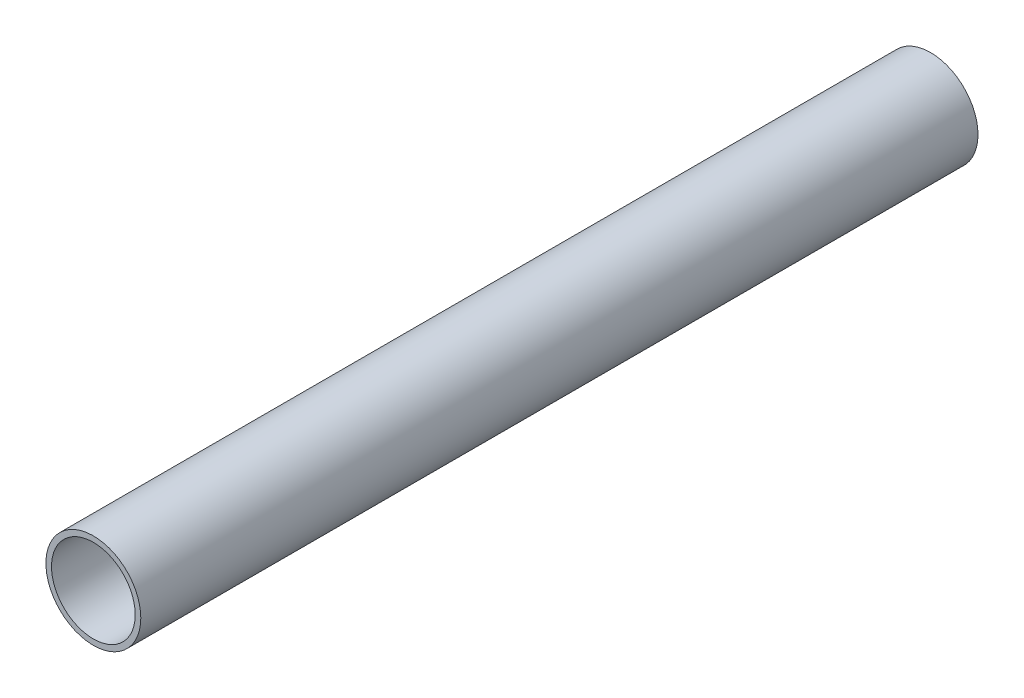
ISO-10303-21;
HEADER;
FILE_DESCRIPTION(('STEP AP214'),'2;1');
FILE_NAME('part.step','',(''),(''),'','','');
FILE_SCHEMA(('AUTOMOTIVE_DESIGN { 1 0 10303 214 1 1 1 1 }'));
ENDSEC;
DATA;
#1=APPLICATION_CONTEXT('core data for automotive mechanical design processes');
#2=APPLICATION_PROTOCOL_DEFINITION('international standard','automotive_design',2000,#1);
#3=PRODUCT_CONTEXT('',#1,'mechanical');
#4=PRODUCT('Part','Part','',(#3));
#5=PRODUCT_RELATED_PRODUCT_CATEGORY('part','',(#4));
#6=PRODUCT_DEFINITION_FORMATION('','',#4);
#7=PRODUCT_DEFINITION_CONTEXT('part definition',#1,'design');
#8=PRODUCT_DEFINITION('design','',#6,#7);
#9=PRODUCT_DEFINITION_SHAPE('','',#8);
#10=(LENGTH_UNIT() NAMED_UNIT(*) SI_UNIT(.MILLI.,.METRE.));
#11=(NAMED_UNIT(*) PLANE_ANGLE_UNIT() SI_UNIT($,.RADIAN.));
#12=(NAMED_UNIT(*) SI_UNIT($,.STERADIAN.) SOLID_ANGLE_UNIT());
#13=UNCERTAINTY_MEASURE_WITH_UNIT(LENGTH_MEASURE(1.E-05),#10,'distance_accuracy_value','');
#14=(GEOMETRIC_REPRESENTATION_CONTEXT(3) GLOBAL_UNCERTAINTY_ASSIGNED_CONTEXT((#13)) GLOBAL_UNIT_ASSIGNED_CONTEXT((#10,
#11,#12)) REPRESENTATION_CONTEXT('',''));
#15=CARTESIAN_POINT('',(0.,0.,0.));
#16=DIRECTION('',(0.,0.,1.));
#17=DIRECTION('',(1.,0.,0.));
#18=AXIS2_PLACEMENT_3D('',#15,#16,#17);
#19=CARTESIAN_POINT('',(0.,0.,150.));
#20=DIRECTION('',(0.,0.,-1.));
#21=DIRECTION('',(-1.,0.,0.));
#22=AXIS2_PLACEMENT_3D('',#19,#20,#21);
#23=CYLINDRICAL_SURFACE('',#22,15.);
#24=CARTESIAN_POINT('',(0.,0.,150.));
#25=DIRECTION('',(0.,0.,1.));
#26=DIRECTION('',(1.,0.,0.));
#27=AXIS2_PLACEMENT_3D('',#24,#25,#26);
#28=CIRCLE('',#27,15.);
#29=CARTESIAN_POINT('',(15.,0.,150.));
#30=VERTEX_POINT('',#29);
#31=EDGE_CURVE('E40',#30,#30,#28,.T.);
#32=ORIENTED_EDGE('',*,*,#31,.T.);
#33=EDGE_LOOP('',(#32));
#34=FACE_BOUND('',#33,.T.);
#35=CARTESIAN_POINT('',(0.,0.,-150.));
#36=DIRECTION('',(0.,0.,1.));
#37=DIRECTION('',(1.,0.,0.));
#38=AXIS2_PLACEMENT_3D('',#35,#36,#37);
#39=CIRCLE('',#38,15.);
#40=CARTESIAN_POINT('',(15.,0.,-150.));
#41=VERTEX_POINT('',#40);
#42=EDGE_CURVE('E46',#41,#41,#39,.T.);
#43=ORIENTED_EDGE('',*,*,#42,.F.);
#44=EDGE_LOOP('',(#43));
#45=FACE_BOUND('',#44,.T.);
#46=ADVANCED_FACE('F33',(#34,#45),#23,.F.);
#47=CARTESIAN_POINT('',(0.,0.,150.));
#48=DIRECTION('',(0.,0.,-1.));
#49=DIRECTION('',(-1.,0.,0.));
#50=AXIS2_PLACEMENT_3D('',#47,#48,#49);
#51=CYLINDRICAL_SURFACE('',#50,17.);
#52=CARTESIAN_POINT('',(0.,0.,150.));
#53=DIRECTION('',(0.,0.,1.));
#54=DIRECTION('',(1.,0.,0.));
#55=AXIS2_PLACEMENT_3D('',#52,#53,#54);
#56=CIRCLE('',#55,17.);
#57=CARTESIAN_POINT('',(17.,0.,150.));
#58=VERTEX_POINT('',#57);
#59=EDGE_CURVE('E10',#58,#58,#56,.T.);
#60=ORIENTED_EDGE('',*,*,#59,.F.);
#61=EDGE_LOOP('',(#60));
#62=FACE_BOUND('',#61,.T.);
#63=CARTESIAN_POINT('',(0.,0.,-150.));
#64=DIRECTION('',(0.,0.,1.));
#65=DIRECTION('',(1.,0.,0.));
#66=AXIS2_PLACEMENT_3D('',#63,#64,#65);
#67=CIRCLE('',#66,17.);
#68=CARTESIAN_POINT('',(17.,0.,-150.));
#69=VERTEX_POINT('',#68);
#70=EDGE_CURVE('E36',#69,#69,#67,.T.);
#71=ORIENTED_EDGE('',*,*,#70,.T.);
#72=EDGE_LOOP('',(#71));
#73=FACE_BOUND('',#72,.T.);
#74=ADVANCED_FACE('F53',(#62,#73),#51,.T.);
#75=CARTESIAN_POINT('',(0.,0.,150.));
#76=DIRECTION('',(0.,0.,1.));
#77=DIRECTION('',(1.,0.,0.));
#78=AXIS2_PLACEMENT_3D('',#75,#76,#77);
#79=PLANE('',#78);
#80=ORIENTED_EDGE('',*,*,#31,.F.);
#81=EDGE_LOOP('',(#80));
#82=FACE_BOUND('',#81,.T.);
#83=ORIENTED_EDGE('',*,*,#59,.T.);
#84=EDGE_LOOP('',(#83));
#85=FACE_BOUND('',#84,.T.);
#86=ADVANCED_FACE('F57',(#82,#85),#79,.T.);
#87=CARTESIAN_POINT('',(0.,0.,-150.));
#88=DIRECTION('',(0.,0.,1.));
#89=DIRECTION('',(1.,0.,0.));
#90=AXIS2_PLACEMENT_3D('',#87,#88,#89);
#91=PLANE('',#90);
#92=ORIENTED_EDGE('',*,*,#42,.T.);
#93=EDGE_LOOP('',(#92));
#94=FACE_BOUND('',#93,.T.);
#95=ORIENTED_EDGE('',*,*,#70,.F.);
#96=EDGE_LOOP('',(#95));
#97=FACE_BOUND('',#96,.T.);
#98=ADVANCED_FACE('F55',(#94,#97),#91,.F.);
#99=CLOSED_SHELL('',(#46,#74,#86,#98));
#100=MANIFOLD_SOLID_BREP('B2',#99);
#101=ADVANCED_BREP_SHAPE_REPRESENTATION('',(#18,#100),#14);
#102=SHAPE_DEFINITION_REPRESENTATION(#9,#101);
ENDSEC;
END-ISO-10303-21;
